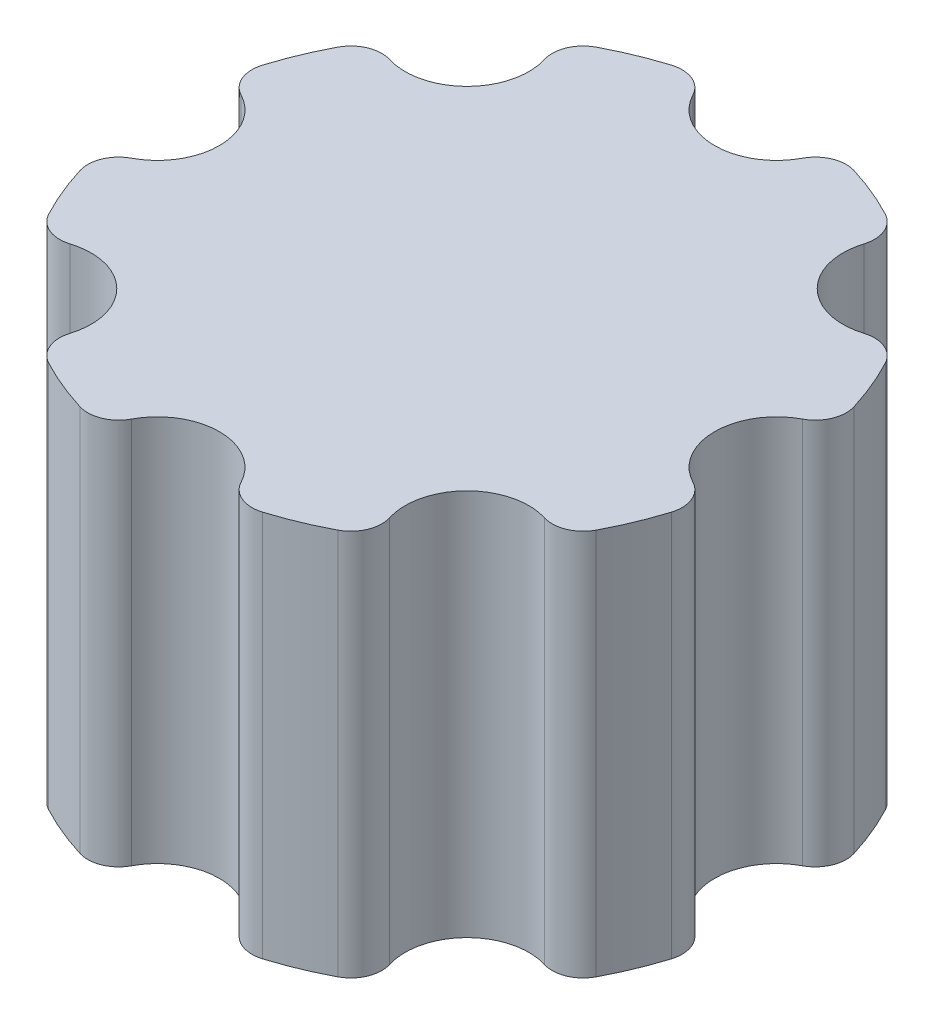
ISO-10303-21;
HEADER;
FILE_DESCRIPTION(('STEP AP214'),'2;1');
FILE_NAME('part.step','',(''),(''),'','','');
FILE_SCHEMA(('AUTOMOTIVE_DESIGN { 1 0 10303 214 1 1 1 1 }'));
ENDSEC;
DATA;
#1=APPLICATION_CONTEXT('core data for automotive mechanical design processes');
#2=APPLICATION_PROTOCOL_DEFINITION('international standard','automotive_design',2000,#1);
#3=PRODUCT_CONTEXT('',#1,'mechanical');
#4=PRODUCT('Part','Part','',(#3));
#5=PRODUCT_RELATED_PRODUCT_CATEGORY('part','',(#4));
#6=PRODUCT_DEFINITION_FORMATION('','',#4);
#7=PRODUCT_DEFINITION_CONTEXT('part definition',#1,'design');
#8=PRODUCT_DEFINITION('design','',#6,#7);
#9=PRODUCT_DEFINITION_SHAPE('','',#8);
#10=(LENGTH_UNIT() NAMED_UNIT(*) SI_UNIT(.MILLI.,.METRE.));
#11=(NAMED_UNIT(*) PLANE_ANGLE_UNIT() SI_UNIT($,.RADIAN.));
#12=(NAMED_UNIT(*) SI_UNIT($,.STERADIAN.) SOLID_ANGLE_UNIT());
#13=UNCERTAINTY_MEASURE_WITH_UNIT(LENGTH_MEASURE(1.E-05),#10,'distance_accuracy_value','');
#14=(GEOMETRIC_REPRESENTATION_CONTEXT(3) GLOBAL_UNCERTAINTY_ASSIGNED_CONTEXT((#13)) GLOBAL_UNIT_ASSIGNED_CONTEXT((#10,
#11,#12)) REPRESENTATION_CONTEXT('',''));
#15=CARTESIAN_POINT('',(0.,0.,0.));
#16=DIRECTION('',(0.,0.,1.));
#17=DIRECTION('',(1.,0.,0.));
#18=AXIS2_PLACEMENT_3D('',#15,#16,#17);
#19=CARTESIAN_POINT('',(0.,25.,0.));
#20=DIRECTION('',(0.,-1.,0.));
#21=DIRECTION('',(0.,0.,-1.));
#22=AXIS2_PLACEMENT_3D('',#19,#20,#21);
#23=CYLINDRICAL_SURFACE('',#22,20.);
#24=CARTESIAN_POINT('',(0.,0.,0.));
#25=DIRECTION('',(0.,1.,0.));
#26=DIRECTION('',(0.,0.,1.));
#27=AXIS2_PLACEMENT_3D('',#24,#25,#26);
#28=CIRCLE('',#27,20.);
#29=CARTESIAN_POINT('',(19.1111111111105,0.,-5.89622184952277));
#30=VERTEX_POINT('',#29);
#31=CARTESIAN_POINT('',(17.6828547158522,0.,-9.3443378095007));
#32=VERTEX_POINT('',#31);
#33=EDGE_CURVE('E288',#30,#32,#28,.T.);
#34=ORIENTED_EDGE('',*,*,#33,.T.);
#35=DIRECTION('',(0.,-1.,0.));
#36=VECTOR('',#35,1.);
#37=CARTESIAN_POINT('',(17.6828547158522,25.,-9.3443378095007));
#38=LINE('',#37,#36);
#39=CARTESIAN_POINT('',(17.6828547158522,25.,-9.3443378095007));
#40=VERTEX_POINT('',#39);
#41=EDGE_CURVE('E410',#32,#40,#38,.F.);
#42=ORIENTED_EDGE('',*,*,#41,.T.);
#43=CARTESIAN_POINT('',(0.,25.,0.));
#44=DIRECTION('',(0.,1.,0.));
#45=DIRECTION('',(0.,0.,1.));
#46=AXIS2_PLACEMENT_3D('',#43,#44,#45);
#47=CIRCLE('',#46,20.);
#48=CARTESIAN_POINT('',(19.1111111111105,25.,-5.89622184952277));
#49=VERTEX_POINT('',#48);
#50=EDGE_CURVE('E305',#49,#40,#47,.T.);
#51=ORIENTED_EDGE('',*,*,#50,.F.);
#52=DIRECTION('',(0.,-1.,0.));
#53=VECTOR('',#52,1.);
#54=CARTESIAN_POINT('',(19.1111111111105,25.,-5.89622184952277));
#55=LINE('',#54,#53);
#56=EDGE_CURVE('E407',#49,#30,#55,.T.);
#57=ORIENTED_EDGE('',*,*,#56,.T.);
#58=EDGE_LOOP('',(#34,#42,#51,#57));
#59=FACE_BOUND('',#58,.T.);
#60=ADVANCED_FACE('F37',(#59),#23,.T.);
#61=CARTESIAN_POINT('',(17.682854715855,0.,9.34433780949531));
#62=VERTEX_POINT('',#61);
#63=CARTESIAN_POINT('',(19.1111111111115,0.,5.89622184951951));
#64=VERTEX_POINT('',#63);
#65=EDGE_CURVE('E282',#62,#64,#28,.T.);
#66=ORIENTED_EDGE('',*,*,#65,.T.);
#67=DIRECTION('',(0.,-1.,0.));
#68=VECTOR('',#67,1.);
#69=CARTESIAN_POINT('',(19.1111111111115,25.,5.89622184951952));
#70=LINE('',#69,#68);
#71=CARTESIAN_POINT('',(19.1111111111115,25.,5.89622184951951));
#72=VERTEX_POINT('',#71);
#73=EDGE_CURVE('E420',#64,#72,#70,.F.);
#74=ORIENTED_EDGE('',*,*,#73,.T.);
#75=CARTESIAN_POINT('',(17.682854715855,25.,9.34433780949531));
#76=VERTEX_POINT('',#75);
#77=EDGE_CURVE('E307',#76,#72,#47,.T.);
#78=ORIENTED_EDGE('',*,*,#77,.F.);
#79=DIRECTION('',(0.,-1.,0.));
#80=VECTOR('',#79,1.);
#81=CARTESIAN_POINT('',(17.682854715855,25.,9.34433780949531));
#82=LINE('',#81,#80);
#83=EDGE_CURVE('E417',#76,#62,#82,.T.);
#84=ORIENTED_EDGE('',*,*,#83,.T.);
#85=EDGE_LOOP('',(#66,#74,#78,#84));
#86=FACE_BOUND('',#85,.T.);
#87=ADVANCED_FACE('F602',(#86),#23,.T.);
#88=CARTESIAN_POINT('',(5.89622184952762,25.,19.111111111109));
#89=VERTEX_POINT('',#88);
#90=CARTESIAN_POINT('',(9.34433780950046,25.,17.6828547158523));
#91=VERTEX_POINT('',#90);
#92=EDGE_CURVE('E311',#89,#91,#47,.T.);
#93=ORIENTED_EDGE('',*,*,#92,.F.);
#94=DIRECTION('',(0.,-1.,0.));
#95=VECTOR('',#94,1.);
#96=CARTESIAN_POINT('',(5.89622184952762,25.,19.111111111109));
#97=LINE('',#96,#95);
#98=CARTESIAN_POINT('',(5.89622184952762,0.,19.111111111109));
#99=VERTEX_POINT('',#98);
#100=EDGE_CURVE('E11',#89,#99,#97,.T.);
#101=ORIENTED_EDGE('',*,*,#100,.T.);
#102=CARTESIAN_POINT('',(9.34433780950046,0.,17.6828547158523));
#103=VERTEX_POINT('',#102);
#104=EDGE_CURVE('E275',#99,#103,#28,.T.);
#105=ORIENTED_EDGE('',*,*,#104,.T.);
#106=DIRECTION('',(0.,-1.,0.));
#107=VECTOR('',#106,1.);
#108=CARTESIAN_POINT('',(9.34433780950046,25.,17.6828547158523));
#109=LINE('',#108,#107);
#110=EDGE_CURVE('E45',#103,#91,#109,.F.);
#111=ORIENTED_EDGE('',*,*,#110,.T.);
#112=EDGE_LOOP('',(#93,#101,#105,#111));
#113=FACE_BOUND('',#112,.T.);
#114=ADVANCED_FACE('F329',(#113),#23,.T.);
#115=CARTESIAN_POINT('',(-9.34433780949342,0.,17.682854715856));
#116=VERTEX_POINT('',#115);
#117=CARTESIAN_POINT('',(-5.89622184952111,0.,19.111111111111));
#118=VERTEX_POINT('',#117);
#119=EDGE_CURVE('E264',#116,#118,#28,.T.);
#120=ORIENTED_EDGE('',*,*,#119,.T.);
#121=DIRECTION('',(0.,-1.,0.));
#122=VECTOR('',#121,1.);
#123=CARTESIAN_POINT('',(-5.89622184952111,25.,19.111111111111));
#124=LINE('',#123,#122);
#125=CARTESIAN_POINT('',(-5.89622184952111,25.,19.111111111111));
#126=VERTEX_POINT('',#125);
#127=EDGE_CURVE('E268',#118,#126,#124,.F.);
#128=ORIENTED_EDGE('',*,*,#127,.T.);
#129=CARTESIAN_POINT('',(-9.34433780949342,25.,17.682854715856));
#130=VERTEX_POINT('',#129);
#131=EDGE_CURVE('E267',#130,#126,#47,.T.);
#132=ORIENTED_EDGE('',*,*,#131,.F.);
#133=DIRECTION('',(0.,-1.,0.));
#134=VECTOR('',#133,1.);
#135=CARTESIAN_POINT('',(-9.34433780949342,25.,17.682854715856));
#136=LINE('',#135,#134);
#137=EDGE_CURVE('E251',#130,#116,#136,.T.);
#138=ORIENTED_EDGE('',*,*,#137,.T.);
#139=EDGE_LOOP('',(#120,#128,#132,#138));
#140=FACE_BOUND('',#139,.T.);
#141=ADVANCED_FACE('F262',(#140),#23,.T.);
#142=CARTESIAN_POINT('',(-19.1111111111096,0.,5.89622184952571));
#143=VERTEX_POINT('',#142);
#144=CARTESIAN_POINT('',(-17.6828547158533,0.,9.34433780949857));
#145=VERTEX_POINT('',#144);
#146=EDGE_CURVE('E274',#143,#145,#28,.T.);
#147=ORIENTED_EDGE('',*,*,#146,.T.);
#148=DIRECTION('',(0.,-1.,0.));
#149=VECTOR('',#148,1.);
#150=CARTESIAN_POINT('',(-17.6828547158533,25.,9.34433780949857));
#151=LINE('',#150,#149);
#152=CARTESIAN_POINT('',(-17.6828547158533,25.,9.34433780949857));
#153=VERTEX_POINT('',#152);
#154=EDGE_CURVE('E373',#145,#153,#151,.F.);
#155=ORIENTED_EDGE('',*,*,#154,.T.);
#156=CARTESIAN_POINT('',(-19.1111111111096,25.,5.89622184952571));
#157=VERTEX_POINT('',#156);
#158=EDGE_CURVE('E314',#157,#153,#47,.T.);
#159=ORIENTED_EDGE('',*,*,#158,.F.);
#160=DIRECTION('',(0.,-1.,0.));
#161=VECTOR('',#160,1.);
#162=CARTESIAN_POINT('',(-19.1111111111096,25.,5.89622184952571));
#163=LINE('',#162,#161);
#164=EDGE_CURVE('E370',#157,#143,#163,.T.);
#165=ORIENTED_EDGE('',*,*,#164,.T.);
#166=EDGE_LOOP('',(#147,#155,#159,#165));
#167=FACE_BOUND('',#166,.T.);
#168=ADVANCED_FACE('F584',(#167),#23,.T.);
#169=CARTESIAN_POINT('',(-17.6828547158537,0.,-9.34433780949779));
#170=VERTEX_POINT('',#169);
#171=CARTESIAN_POINT('',(-19.1111111111106,0.,-5.89622184952245));
#172=VERTEX_POINT('',#171);
#173=EDGE_CURVE('E280',#170,#172,#28,.T.);
#174=ORIENTED_EDGE('',*,*,#173,.T.);
#175=DIRECTION('',(0.,-1.,0.));
#176=VECTOR('',#175,1.);
#177=CARTESIAN_POINT('',(-19.1111111111106,25.,-5.89622184952245));
#178=LINE('',#177,#176);
#179=CARTESIAN_POINT('',(-19.1111111111106,25.,-5.89622184952245));
#180=VERTEX_POINT('',#179);
#181=EDGE_CURVE('E383',#172,#180,#178,.F.);
#182=ORIENTED_EDGE('',*,*,#181,.T.);
#183=CARTESIAN_POINT('',(-17.6828547158537,25.,-9.34433780949779));
#184=VERTEX_POINT('',#183);
#185=EDGE_CURVE('E316',#184,#180,#47,.T.);
#186=ORIENTED_EDGE('',*,*,#185,.F.);
#187=DIRECTION('',(0.,-1.,0.));
#188=VECTOR('',#187,1.);
#189=CARTESIAN_POINT('',(-17.6828547158537,25.,-9.34433780949779));
#190=LINE('',#189,#188);
#191=EDGE_CURVE('E380',#184,#170,#190,.T.);
#192=ORIENTED_EDGE('',*,*,#191,.T.);
#193=EDGE_LOOP('',(#174,#182,#186,#192));
#194=FACE_BOUND('',#193,.T.);
#195=ADVANCED_FACE('F499',(#194),#23,.T.);
#196=CARTESIAN_POINT('',(-5.89622184952072,0.,-19.1111111111111));
#197=VERTEX_POINT('',#196);
#198=CARTESIAN_POINT('',(-9.34433780949868,0.,-17.6828547158532));
#199=VERTEX_POINT('',#198);
#200=EDGE_CURVE('E277',#197,#199,#28,.T.);
#201=ORIENTED_EDGE('',*,*,#200,.T.);
#202=DIRECTION('',(0.,-1.,0.));
#203=VECTOR('',#202,1.);
#204=CARTESIAN_POINT('',(-9.34433780949868,25.,-17.6828547158532));
#205=LINE('',#204,#203);
#206=CARTESIAN_POINT('',(-9.34433780949868,25.,-17.6828547158532));
#207=VERTEX_POINT('',#206);
#208=EDGE_CURVE('E393',#199,#207,#205,.F.);
#209=ORIENTED_EDGE('',*,*,#208,.T.);
#210=CARTESIAN_POINT('',(-5.89622184952072,25.,-19.1111111111111));
#211=VERTEX_POINT('',#210);
#212=EDGE_CURVE('E313',#211,#207,#47,.T.);
#213=ORIENTED_EDGE('',*,*,#212,.F.);
#214=DIRECTION('',(0.,-1.,0.));
#215=VECTOR('',#214,1.);
#216=CARTESIAN_POINT('',(-5.89622184952072,25.,-19.1111111111111));
#217=LINE('',#216,#215);
#218=EDGE_CURVE('E390',#211,#197,#217,.T.);
#219=ORIENTED_EDGE('',*,*,#218,.T.);
#220=EDGE_LOOP('',(#201,#209,#213,#219));
#221=FACE_BOUND('',#220,.T.);
#222=ADVANCED_FACE('F515',(#221),#23,.T.);
#223=CARTESIAN_POINT('',(9.34433780949982,0.,-17.6828547158526));
#224=VERTEX_POINT('',#223);
#225=CARTESIAN_POINT('',(5.89622184952072,0.,-19.1111111111111));
#226=VERTEX_POINT('',#225);
#227=EDGE_CURVE('E278',#224,#226,#28,.T.);
#228=ORIENTED_EDGE('',*,*,#227,.T.);
#229=DIRECTION('',(0.,-1.,0.));
#230=VECTOR('',#229,1.);
#231=CARTESIAN_POINT('',(5.89622184952072,25.,-19.1111111111111));
#232=LINE('',#231,#230);
#233=CARTESIAN_POINT('',(5.89622184952072,25.,-19.1111111111111));
#234=VERTEX_POINT('',#233);
#235=EDGE_CURVE('E401',#226,#234,#232,.F.);
#236=ORIENTED_EDGE('',*,*,#235,.T.);
#237=CARTESIAN_POINT('',(9.34433780949982,25.,-17.6828547158526));
#238=VERTEX_POINT('',#237);
#239=EDGE_CURVE('E286',#238,#234,#47,.T.);
#240=ORIENTED_EDGE('',*,*,#239,.F.);
#241=DIRECTION('',(0.,-1.,0.));
#242=VECTOR('',#241,1.);
#243=CARTESIAN_POINT('',(9.34433780949982,25.,-17.6828547158526));
#244=LINE('',#243,#242);
#245=EDGE_CURVE('E399',#238,#224,#244,.T.);
#246=ORIENTED_EDGE('',*,*,#245,.T.);
#247=EDGE_LOOP('',(#228,#236,#240,#246));
#248=FACE_BOUND('',#247,.T.);
#249=ADVANCED_FACE('F525',(#248),#23,.T.);
#250=CARTESIAN_POINT('',(0.,25.,0.));
#251=DIRECTION('',(0.,1.,0.));
#252=DIRECTION('',(0.,0.,1.));
#253=AXIS2_PLACEMENT_3D('',#250,#251,#252);
#254=PLANE('',#253);
#255=ORIENTED_EDGE('',*,*,#131,.T.);
#256=CARTESIAN_POINT('',(-5.306599664569,25.,17.1999999999999));
#257=DIRECTION('',(0.,1.,0.));
#258=DIRECTION('',(0.,0.,1.));
#259=AXIS2_PLACEMENT_3D('',#256,#257,#258);
#260=CIRCLE('',#259,2.);
#261=CARTESIAN_POINT('',(-3.53773310971254,25.,18.1333333333327));
#262=VERTEX_POINT('',#261);
#263=EDGE_CURVE('E470',#126,#262,#260,.T.);
#264=ORIENTED_EDGE('',*,*,#263,.T.);
#265=CARTESIAN_POINT('',(3.40570654445189E-12,25.,20.));
#266=DIRECTION('',(0.,1.,0.));
#267=DIRECTION('',(0.,0.,1.));
#268=AXIS2_PLACEMENT_3D('',#265,#266,#267);
#269=CIRCLE('',#268,4.00000000000339);
#270=CARTESIAN_POINT('',(3.53773310971871,25.,18.1333333333315));
#271=VERTEX_POINT('',#270);
#272=EDGE_CURVE('E476',#271,#262,#269,.T.);
#273=ORIENTED_EDGE('',*,*,#272,.F.);
#274=CARTESIAN_POINT('',(5.30659966457486,25.,17.1999999999981));
#275=DIRECTION('',(0.,1.,0.));
#276=DIRECTION('',(0.,0.,1.));
#277=AXIS2_PLACEMENT_3D('',#274,#275,#276);
#278=CIRCLE('',#277,2.);
#279=EDGE_CURVE('E325',#271,#89,#278,.T.);
#280=ORIENTED_EDGE('',*,*,#279,.T.);
#281=ORIENTED_EDGE('',*,*,#92,.T.);
#282=CARTESIAN_POINT('',(8.40990402855041,25.,15.9145692442671));
#283=DIRECTION('',(0.,1.,0.));
#284=DIRECTION('',(0.,0.,1.));
#285=AXIS2_PLACEMENT_3D('',#282,#283,#284);
#286=CIRCLE('',#285,2.);
#287=CARTESIAN_POINT('',(10.3206478936108,25.,15.3237580374216));
#288=VERTEX_POINT('',#287);
#289=EDGE_CURVE('E321',#91,#288,#286,.T.);
#290=ORIENTED_EDGE('',*,*,#289,.T.);
#291=CARTESIAN_POINT('',(14.1421356237339,25.,14.1421356237297));
#292=DIRECTION('',(0.,1.,0.));
#293=DIRECTION('',(0.,0.,1.));
#294=AXIS2_PLACEMENT_3D('',#291,#292,#293);
#295=CIRCLE('',#294,4.00000000000253);
#296=CARTESIAN_POINT('',(15.3237580374245,25.,10.3206478936063));
#297=VERTEX_POINT('',#296);
#298=EDGE_CURVE('E430',#297,#288,#295,.T.);
#299=ORIENTED_EDGE('',*,*,#298,.F.);
#300=CARTESIAN_POINT('',(15.9145692442695,25.,8.40990402854578));
#301=DIRECTION('',(0.,1.,0.));
#302=DIRECTION('',(0.,0.,1.));
#303=AXIS2_PLACEMENT_3D('',#300,#301,#302);
#304=CIRCLE('',#303,2.);
#305=EDGE_CURVE('E436',#297,#76,#304,.T.);
#306=ORIENTED_EDGE('',*,*,#305,.T.);
#307=ORIENTED_EDGE('',*,*,#77,.T.);
#308=CARTESIAN_POINT('',(17.2000000000003,25.,5.30659966456756));
#309=DIRECTION('',(0.,1.,0.));
#310=DIRECTION('',(0.,0.,1.));
#311=AXIS2_PLACEMENT_3D('',#308,#309,#310);
#312=CIRCLE('',#311,2.);
#313=CARTESIAN_POINT('',(18.1333333333339,25.,3.5377331097115));
#314=VERTEX_POINT('',#313);
#315=EDGE_CURVE('E442',#72,#314,#312,.T.);
#316=ORIENTED_EDGE('',*,*,#315,.T.);
#317=CARTESIAN_POINT('',(20.0000000000017,25.,-1.70285327222595E-12));
#318=DIRECTION('',(0.,1.,0.));
#319=DIRECTION('',(0.,0.,1.));
#320=AXIS2_PLACEMENT_3D('',#317,#318,#319);
#321=CIRCLE('',#320,4.0000000000012);
#322=CARTESIAN_POINT('',(18.1333333333333,25.,-3.53773310971459));
#323=VERTEX_POINT('',#322);
#324=EDGE_CURVE('E555',#323,#314,#321,.T.);
#325=ORIENTED_EDGE('',*,*,#324,.F.);
#326=CARTESIAN_POINT('',(17.1999999999994,25.,-5.30659966457049));
#327=DIRECTION('',(0.,1.,0.));
#328=DIRECTION('',(0.,0.,1.));
#329=AXIS2_PLACEMENT_3D('',#326,#327,#328);
#330=CIRCLE('',#329,2.);
#331=EDGE_CURVE('E444',#323,#49,#330,.T.);
#332=ORIENTED_EDGE('',*,*,#331,.T.);
#333=ORIENTED_EDGE('',*,*,#50,.T.);
#334=CARTESIAN_POINT('',(15.914569244267,25.,-8.40990402855063));
#335=DIRECTION('',(0.,1.,0.));
#336=DIRECTION('',(0.,0.,1.));
#337=AXIS2_PLACEMENT_3D('',#334,#335,#336);
#338=CIRCLE('',#337,2.);
#339=CARTESIAN_POINT('',(15.3237580374218,25.,-10.3206478936111));
#340=VERTEX_POINT('',#339);
#341=EDGE_CURVE('E450',#40,#340,#338,.T.);
#342=ORIENTED_EDGE('',*,*,#341,.T.);
#343=CARTESIAN_POINT('',(14.1421356237314,25.,-14.1421356237322));
#344=DIRECTION('',(0.,1.,0.));
#345=DIRECTION('',(0.,0.,1.));
#346=AXIS2_PLACEMENT_3D('',#343,#344,#345);
#347=CIRCLE('',#346,4.00000000000016);
#348=CARTESIAN_POINT('',(10.3206478936103,25.,-15.3237580374223));
#349=VERTEX_POINT('',#348);
#350=EDGE_CURVE('E296',#349,#340,#347,.T.);
#351=ORIENTED_EDGE('',*,*,#350,.F.);
#352=CARTESIAN_POINT('',(8.40990402854984,25.,-15.9145692442674));
#353=DIRECTION('',(0.,1.,0.));
#354=DIRECTION('',(0.,0.,1.));
#355=AXIS2_PLACEMENT_3D('',#352,#353,#354);
#356=CIRCLE('',#355,2.);
#357=EDGE_CURVE('E452',#349,#238,#356,.T.);
#358=ORIENTED_EDGE('',*,*,#357,.T.);
#359=ORIENTED_EDGE('',*,*,#239,.T.);
#360=CARTESIAN_POINT('',(5.30659966456865,25.,-17.2));
#361=DIRECTION('',(0.,1.,0.));
#362=DIRECTION('',(0.,0.,1.));
#363=AXIS2_PLACEMENT_3D('',#360,#361,#362);
#364=CIRCLE('',#363,2.);
#365=CARTESIAN_POINT('',(3.53773310971243,25.,-18.1333333333333));
#366=VERTEX_POINT('',#365);
#367=EDGE_CURVE('E454',#234,#366,#364,.T.);
#368=ORIENTED_EDGE('',*,*,#367,.T.);
#369=CARTESIAN_POINT('',(0.,25.,-20.));
#370=DIRECTION('',(0.,1.,0.));
#371=DIRECTION('',(0.,0.,1.));
#372=AXIS2_PLACEMENT_3D('',#369,#370,#371);
#373=CIRCLE('',#372,4.);
#374=CARTESIAN_POINT('',(-3.53773310971243,25.,-18.1333333333333));
#375=VERTEX_POINT('',#374);
#376=EDGE_CURVE('E289',#375,#366,#373,.T.);
#377=ORIENTED_EDGE('',*,*,#376,.F.);
#378=CARTESIAN_POINT('',(-5.30659966456865,25.,-17.2));
#379=DIRECTION('',(0.,1.,0.));
#380=DIRECTION('',(0.,0.,1.));
#381=AXIS2_PLACEMENT_3D('',#378,#379,#380);
#382=CIRCLE('',#381,2.);
#383=EDGE_CURVE('E456',#375,#211,#382,.T.);
#384=ORIENTED_EDGE('',*,*,#383,.T.);
#385=ORIENTED_EDGE('',*,*,#212,.T.);
#386=CARTESIAN_POINT('',(-8.40990402854882,25.,-15.9145692442679));
#387=DIRECTION('',(0.,1.,0.));
#388=DIRECTION('',(0.,0.,1.));
#389=AXIS2_PLACEMENT_3D('',#386,#387,#388);
#390=CIRCLE('',#389,2.);
#391=CARTESIAN_POINT('',(-10.320647893609,25.,-15.323758037422));
#392=VERTEX_POINT('',#391);
#393=EDGE_CURVE('E458',#207,#392,#390,.T.);
#394=ORIENTED_EDGE('',*,*,#393,.T.);
#395=CARTESIAN_POINT('',(-14.1421356237305,25.,-14.1421356237297));
#396=DIRECTION('',(0.,1.,0.));
#397=DIRECTION('',(0.,0.,1.));
#398=AXIS2_PLACEMENT_3D('',#395,#396,#397);
#399=CIRCLE('',#398,4.00000000000107);
#400=CARTESIAN_POINT('',(-15.3237580374225,25.,-10.3206478936082));
#401=VERTEX_POINT('',#400);
#402=EDGE_CURVE('E303',#401,#392,#399,.T.);
#403=ORIENTED_EDGE('',*,*,#402,.F.);
#404=CARTESIAN_POINT('',(-15.9145692442683,25.,-8.40990402854801));
#405=DIRECTION('',(0.,1.,0.));
#406=DIRECTION('',(0.,0.,1.));
#407=AXIS2_PLACEMENT_3D('',#404,#405,#406);
#408=CIRCLE('',#407,2.);
#409=EDGE_CURVE('E460',#401,#184,#408,.T.);
#410=ORIENTED_EDGE('',*,*,#409,.T.);
#411=ORIENTED_EDGE('',*,*,#185,.T.);
#412=CARTESIAN_POINT('',(-17.1999999999995,25.,-5.3065996645702));
#413=DIRECTION('',(0.,1.,0.));
#414=DIRECTION('',(0.,0.,1.));
#415=AXIS2_PLACEMENT_3D('',#412,#413,#414);
#416=CIRCLE('',#415,2.);
#417=CARTESIAN_POINT('',(-18.1333333333321,25.,-3.53773310971359));
#418=VERTEX_POINT('',#417);
#419=EDGE_CURVE('E462',#180,#418,#416,.T.);
#420=ORIENTED_EDGE('',*,*,#419,.T.);
#421=CARTESIAN_POINT('',(-19.9999999999983,25.,1.70530256582424E-12));
#422=DIRECTION('',(0.,1.,0.));
#423=DIRECTION('',(0.,0.,1.));
#424=AXIS2_PLACEMENT_3D('',#421,#422,#423);
#425=CIRCLE('',#424,4.00000000000233);
#426=CARTESIAN_POINT('',(-18.1333333333315,25.,3.53773310971668));
#427=VERTEX_POINT('',#426);
#428=EDGE_CURVE('E568',#427,#418,#425,.T.);
#429=ORIENTED_EDGE('',*,*,#428,.F.);
#430=CARTESIAN_POINT('',(-17.1999999999986,25.,5.30659966457314));
#431=DIRECTION('',(0.,1.,0.));
#432=DIRECTION('',(0.,0.,1.));
#433=AXIS2_PLACEMENT_3D('',#430,#431,#432);
#434=CIRCLE('',#433,2.);
#435=EDGE_CURVE('E464',#427,#157,#434,.T.);
#436=ORIENTED_EDGE('',*,*,#435,.T.);
#437=ORIENTED_EDGE('',*,*,#158,.T.);
#438=CARTESIAN_POINT('',(-15.914569244268,25.,8.40990402854871));
#439=DIRECTION('',(0.,1.,0.));
#440=DIRECTION('',(0.,0.,1.));
#441=AXIS2_PLACEMENT_3D('',#438,#439,#440);
#442=CIRCLE('',#441,2.);
#443=CARTESIAN_POINT('',(-15.3237580374217,25.,10.3206478936088));
#444=VERTEX_POINT('',#443);
#445=EDGE_CURVE('E466',#153,#444,#442,.T.);
#446=ORIENTED_EDGE('',*,*,#445,.T.);
#447=CARTESIAN_POINT('',(-14.142135623728,25.,14.1421356237322));
#448=DIRECTION('',(0.,1.,0.));
#449=DIRECTION('',(0.,0.,1.));
#450=AXIS2_PLACEMENT_3D('',#447,#448,#449);
#451=CIRCLE('',#450,4.0000000000033);
#452=CARTESIAN_POINT('',(-10.3206478936044,25.,15.3237580374247));
#453=VERTEX_POINT('',#452);
#454=EDGE_CURVE('E563',#453,#444,#451,.T.);
#455=ORIENTED_EDGE('',*,*,#454,.F.);
#456=CARTESIAN_POINT('',(-8.40990402854408,25.,15.9145692442704));
#457=DIRECTION('',(0.,1.,0.));
#458=DIRECTION('',(0.,0.,1.));
#459=AXIS2_PLACEMENT_3D('',#456,#457,#458);
#460=CIRCLE('',#459,2.);
#461=EDGE_CURVE('E468',#453,#130,#460,.T.);
#462=ORIENTED_EDGE('',*,*,#461,.T.);
#463=EDGE_LOOP('',(#255,#264,#273,#280,#281,#290,#299,#306,#307,#316,#325,#332,#333,#342,#351,
#358,#359,#368,#377,#384,#385,#394,#403,#410,#411,#420,#429,#436,#437,#446,#455,#462));
#464=FACE_BOUND('',#463,.T.);
#465=ADVANCED_FACE('F319',(#464),#254,.T.);
#466=CARTESIAN_POINT('',(0.,0.,0.));
#467=DIRECTION('',(0.,1.,0.));
#468=DIRECTION('',(0.,0.,1.));
#469=AXIS2_PLACEMENT_3D('',#466,#467,#468);
#470=PLANE('',#469);
#471=CARTESIAN_POINT('',(3.40570654445189E-12,0.,20.));
#472=DIRECTION('',(0.,1.,0.));
#473=DIRECTION('',(0.,0.,1.));
#474=AXIS2_PLACEMENT_3D('',#471,#472,#473);
#475=CIRCLE('',#474,4.00000000000339);
#476=CARTESIAN_POINT('',(3.53773310971871,0.,18.1333333333315));
#477=VERTEX_POINT('',#476);
#478=CARTESIAN_POINT('',(-3.53773310971254,0.,18.1333333333327));
#479=VERTEX_POINT('',#478);
#480=EDGE_CURVE('E438',#477,#479,#475,.T.);
#481=ORIENTED_EDGE('',*,*,#480,.T.);
#482=CARTESIAN_POINT('',(-5.306599664569,0.,17.1999999999999));
#483=DIRECTION('',(0.,1.,0.));
#484=DIRECTION('',(0.,0.,1.));
#485=AXIS2_PLACEMENT_3D('',#482,#483,#484);
#486=CIRCLE('',#485,2.);
#487=EDGE_CURVE('E256',#479,#118,#486,.F.);
#488=ORIENTED_EDGE('',*,*,#487,.T.);
#489=ORIENTED_EDGE('',*,*,#119,.F.);
#490=CARTESIAN_POINT('',(-8.40990402854408,0.,15.9145692442704));
#491=DIRECTION('',(0.,1.,0.));
#492=DIRECTION('',(0.,0.,1.));
#493=AXIS2_PLACEMENT_3D('',#490,#491,#492);
#494=CIRCLE('',#493,2.);
#495=CARTESIAN_POINT('',(-10.3206478936044,0.,15.3237580374247));
#496=VERTEX_POINT('',#495);
#497=EDGE_CURVE('E247',#116,#496,#494,.F.);
#498=ORIENTED_EDGE('',*,*,#497,.T.);
#499=CARTESIAN_POINT('',(-14.142135623728,0.,14.1421356237322));
#500=DIRECTION('',(0.,1.,0.));
#501=DIRECTION('',(0.,0.,1.));
#502=AXIS2_PLACEMENT_3D('',#499,#500,#501);
#503=CIRCLE('',#502,4.0000000000033);
#504=CARTESIAN_POINT('',(-15.3237580374217,0.,10.3206478936088));
#505=VERTEX_POINT('',#504);
#506=EDGE_CURVE('E561',#496,#505,#503,.T.);
#507=ORIENTED_EDGE('',*,*,#506,.T.);
#508=CARTESIAN_POINT('',(-15.914569244268,0.,8.40990402854871));
#509=DIRECTION('',(0.,1.,0.));
#510=DIRECTION('',(0.,0.,1.));
#511=AXIS2_PLACEMENT_3D('',#508,#509,#510);
#512=CIRCLE('',#511,2.);
#513=EDGE_CURVE('E257',#505,#145,#512,.F.);
#514=ORIENTED_EDGE('',*,*,#513,.T.);
#515=ORIENTED_EDGE('',*,*,#146,.F.);
#516=CARTESIAN_POINT('',(-17.1999999999986,0.,5.30659966457314));
#517=DIRECTION('',(0.,1.,0.));
#518=DIRECTION('',(0.,0.,1.));
#519=AXIS2_PLACEMENT_3D('',#516,#517,#518);
#520=CIRCLE('',#519,2.);
#521=CARTESIAN_POINT('',(-18.1333333333315,0.,3.53773310971668));
#522=VERTEX_POINT('',#521);
#523=EDGE_CURVE('E363',#143,#522,#520,.F.);
#524=ORIENTED_EDGE('',*,*,#523,.T.);
#525=CARTESIAN_POINT('',(-19.9999999999983,0.,1.70530256582424E-12));
#526=DIRECTION('',(0.,1.,0.));
#527=DIRECTION('',(0.,0.,1.));
#528=AXIS2_PLACEMENT_3D('',#525,#526,#527);
#529=CIRCLE('',#528,4.00000000000233);
#530=CARTESIAN_POINT('',(-18.1333333333321,0.,-3.53773310971359));
#531=VERTEX_POINT('',#530);
#532=EDGE_CURVE('E566',#522,#531,#529,.T.);
#533=ORIENTED_EDGE('',*,*,#532,.T.);
#534=CARTESIAN_POINT('',(-17.1999999999995,0.,-5.3065996645702));
#535=DIRECTION('',(0.,1.,0.));
#536=DIRECTION('',(0.,0.,1.));
#537=AXIS2_PLACEMENT_3D('',#534,#535,#536);
#538=CIRCLE('',#537,2.);
#539=EDGE_CURVE('E361',#531,#172,#538,.F.);
#540=ORIENTED_EDGE('',*,*,#539,.T.);
#541=ORIENTED_EDGE('',*,*,#173,.F.);
#542=CARTESIAN_POINT('',(-15.9145692442683,0.,-8.40990402854801));
#543=DIRECTION('',(0.,1.,0.));
#544=DIRECTION('',(0.,0.,1.));
#545=AXIS2_PLACEMENT_3D('',#542,#543,#544);
#546=CIRCLE('',#545,2.);
#547=CARTESIAN_POINT('',(-15.3237580374225,0.,-10.3206478936082));
#548=VERTEX_POINT('',#547);
#549=EDGE_CURVE('E359',#170,#548,#546,.F.);
#550=ORIENTED_EDGE('',*,*,#549,.T.);
#551=CARTESIAN_POINT('',(-14.1421356237305,0.,-14.1421356237297));
#552=DIRECTION('',(0.,1.,0.));
#553=DIRECTION('',(0.,0.,1.));
#554=AXIS2_PLACEMENT_3D('',#551,#552,#553);
#555=CIRCLE('',#554,4.00000000000107);
#556=CARTESIAN_POINT('',(-10.320647893609,0.,-15.323758037422));
#557=VERTEX_POINT('',#556);
#558=EDGE_CURVE('E484',#548,#557,#555,.T.);
#559=ORIENTED_EDGE('',*,*,#558,.T.);
#560=CARTESIAN_POINT('',(-8.40990402854882,0.,-15.9145692442679));
#561=DIRECTION('',(0.,1.,0.));
#562=DIRECTION('',(0.,0.,1.));
#563=AXIS2_PLACEMENT_3D('',#560,#561,#562);
#564=CIRCLE('',#563,2.);
#565=EDGE_CURVE('E357',#557,#199,#564,.F.);
#566=ORIENTED_EDGE('',*,*,#565,.T.);
#567=ORIENTED_EDGE('',*,*,#200,.F.);
#568=CARTESIAN_POINT('',(-5.30659966456865,0.,-17.2));
#569=DIRECTION('',(0.,1.,0.));
#570=DIRECTION('',(0.,0.,1.));
#571=AXIS2_PLACEMENT_3D('',#568,#569,#570);
#572=CIRCLE('',#571,2.);
#573=CARTESIAN_POINT('',(-3.53773310971243,0.,-18.1333333333333));
#574=VERTEX_POINT('',#573);
#575=EDGE_CURVE('E59',#197,#574,#572,.F.);
#576=ORIENTED_EDGE('',*,*,#575,.T.);
#577=CARTESIAN_POINT('',(0.,0.,-20.));
#578=DIRECTION('',(0.,1.,0.));
#579=DIRECTION('',(0.,0.,1.));
#580=AXIS2_PLACEMENT_3D('',#577,#578,#579);
#581=CIRCLE('',#580,4.);
#582=CARTESIAN_POINT('',(3.53773310971243,0.,-18.1333333333333));
#583=VERTEX_POINT('',#582);
#584=EDGE_CURVE('E486',#574,#583,#581,.T.);
#585=ORIENTED_EDGE('',*,*,#584,.T.);
#586=CARTESIAN_POINT('',(5.30659966456865,0.,-17.2));
#587=DIRECTION('',(0.,1.,0.));
#588=DIRECTION('',(0.,0.,1.));
#589=AXIS2_PLACEMENT_3D('',#586,#587,#588);
#590=CIRCLE('',#589,2.);
#591=EDGE_CURVE('E354',#583,#226,#590,.F.);
#592=ORIENTED_EDGE('',*,*,#591,.T.);
#593=ORIENTED_EDGE('',*,*,#227,.F.);
#594=CARTESIAN_POINT('',(8.40990402854984,0.,-15.9145692442674));
#595=DIRECTION('',(0.,1.,0.));
#596=DIRECTION('',(0.,0.,1.));
#597=AXIS2_PLACEMENT_3D('',#594,#595,#596);
#598=CIRCLE('',#597,2.);
#599=CARTESIAN_POINT('',(10.3206478936103,0.,-15.3237580374223));
#600=VERTEX_POINT('',#599);
#601=EDGE_CURVE('E352',#224,#600,#598,.F.);
#602=ORIENTED_EDGE('',*,*,#601,.T.);
#603=CARTESIAN_POINT('',(14.1421356237314,0.,-14.1421356237322));
#604=DIRECTION('',(0.,1.,0.));
#605=DIRECTION('',(0.,0.,1.));
#606=AXIS2_PLACEMENT_3D('',#603,#604,#605);
#607=CIRCLE('',#606,4.00000000000016);
#608=CARTESIAN_POINT('',(15.3237580374218,0.,-10.3206478936111));
#609=VERTEX_POINT('',#608);
#610=EDGE_CURVE('E269',#600,#609,#607,.T.);
#611=ORIENTED_EDGE('',*,*,#610,.T.);
#612=CARTESIAN_POINT('',(15.914569244267,0.,-8.40990402855063));
#613=DIRECTION('',(0.,1.,0.));
#614=DIRECTION('',(0.,0.,1.));
#615=AXIS2_PLACEMENT_3D('',#612,#613,#614);
#616=CIRCLE('',#615,2.);
#617=EDGE_CURVE('E350',#609,#32,#616,.F.);
#618=ORIENTED_EDGE('',*,*,#617,.T.);
#619=ORIENTED_EDGE('',*,*,#33,.F.);
#620=CARTESIAN_POINT('',(17.1999999999994,0.,-5.30659966457049));
#621=DIRECTION('',(0.,1.,0.));
#622=DIRECTION('',(0.,0.,1.));
#623=AXIS2_PLACEMENT_3D('',#620,#621,#622);
#624=CIRCLE('',#623,2.);
#625=CARTESIAN_POINT('',(18.1333333333333,0.,-3.53773310971459));
#626=VERTEX_POINT('',#625);
#627=EDGE_CURVE('E348',#30,#626,#624,.F.);
#628=ORIENTED_EDGE('',*,*,#627,.T.);
#629=CARTESIAN_POINT('',(20.0000000000017,0.,-1.70285327222595E-12));
#630=DIRECTION('',(0.,1.,0.));
#631=DIRECTION('',(0.,0.,1.));
#632=AXIS2_PLACEMENT_3D('',#629,#630,#631);
#633=CIRCLE('',#632,4.0000000000012);
#634=CARTESIAN_POINT('',(18.1333333333339,0.,3.5377331097115));
#635=VERTEX_POINT('',#634);
#636=EDGE_CURVE('E300',#626,#635,#633,.T.);
#637=ORIENTED_EDGE('',*,*,#636,.T.);
#638=CARTESIAN_POINT('',(17.2000000000003,0.,5.30659966456756));
#639=DIRECTION('',(0.,1.,0.));
#640=DIRECTION('',(0.,0.,1.));
#641=AXIS2_PLACEMENT_3D('',#638,#639,#640);
#642=CIRCLE('',#641,2.);
#643=EDGE_CURVE('E341',#635,#64,#642,.F.);
#644=ORIENTED_EDGE('',*,*,#643,.T.);
#645=ORIENTED_EDGE('',*,*,#65,.F.);
#646=CARTESIAN_POINT('',(15.9145692442695,0.,8.40990402854578));
#647=DIRECTION('',(0.,1.,0.));
#648=DIRECTION('',(0.,0.,1.));
#649=AXIS2_PLACEMENT_3D('',#646,#647,#648);
#650=CIRCLE('',#649,2.);
#651=CARTESIAN_POINT('',(15.3237580374245,0.,10.3206478936063));
#652=VERTEX_POINT('',#651);
#653=EDGE_CURVE('E338',#62,#652,#650,.F.);
#654=ORIENTED_EDGE('',*,*,#653,.T.);
#655=CARTESIAN_POINT('',(14.1421356237339,0.,14.1421356237297));
#656=DIRECTION('',(0.,1.,0.));
#657=DIRECTION('',(0.,0.,1.));
#658=AXIS2_PLACEMENT_3D('',#655,#656,#657);
#659=CIRCLE('',#658,4.00000000000253);
#660=CARTESIAN_POINT('',(10.3206478936108,0.,15.3237580374216));
#661=VERTEX_POINT('',#660);
#662=EDGE_CURVE('E433',#652,#661,#659,.T.);
#663=ORIENTED_EDGE('',*,*,#662,.T.);
#664=CARTESIAN_POINT('',(8.40990402855041,0.,15.9145692442671));
#665=DIRECTION('',(0.,1.,0.));
#666=DIRECTION('',(0.,0.,1.));
#667=AXIS2_PLACEMENT_3D('',#664,#665,#666);
#668=CIRCLE('',#667,2.);
#669=EDGE_CURVE('E339',#661,#103,#668,.F.);
#670=ORIENTED_EDGE('',*,*,#669,.T.);
#671=ORIENTED_EDGE('',*,*,#104,.F.);
#672=CARTESIAN_POINT('',(5.30659966457486,0.,17.1999999999981));
#673=DIRECTION('',(0.,1.,0.));
#674=DIRECTION('',(0.,0.,1.));
#675=AXIS2_PLACEMENT_3D('',#672,#673,#674);
#676=CIRCLE('',#675,2.);
#677=EDGE_CURVE('E335',#99,#477,#676,.F.);
#678=ORIENTED_EDGE('',*,*,#677,.T.);
#679=EDGE_LOOP('',(#481,#488,#489,#498,#507,#514,#515,#524,#533,#540,#541,#550,#559,#566,#567,
#576,#585,#592,#593,#602,#611,#618,#619,#628,#637,#644,#645,#654,#663,#670,#671,#678));
#680=FACE_BOUND('',#679,.T.);
#681=ADVANCED_FACE('F272',(#680),#470,.F.);
#682=CARTESIAN_POINT('',(0.,0.,-20.));
#683=DIRECTION('',(0.,1.,0.));
#684=DIRECTION('',(0.,0.,1.));
#685=AXIS2_PLACEMENT_3D('',#682,#683,#684);
#686=CYLINDRICAL_SURFACE('',#685,4.);
#687=ORIENTED_EDGE('',*,*,#584,.F.);
#688=DIRECTION('',(0.,1.,0.));
#689=VECTOR('',#688,1.);
#690=CARTESIAN_POINT('',(-3.53773310971243,0.,-18.1333333333333));
#691=LINE('',#690,#689);
#692=EDGE_CURVE('E397',#574,#375,#691,.T.);
#693=ORIENTED_EDGE('',*,*,#692,.T.);
#694=ORIENTED_EDGE('',*,*,#376,.T.);
#695=DIRECTION('',(0.,1.,0.));
#696=VECTOR('',#695,1.);
#697=CARTESIAN_POINT('',(3.53773310971243,0.,-18.1333333333333));
#698=LINE('',#697,#696);
#699=EDGE_CURVE('E52',#366,#583,#698,.F.);
#700=ORIENTED_EDGE('',*,*,#699,.T.);
#701=EDGE_LOOP('',(#687,#693,#694,#700));
#702=FACE_BOUND('',#701,.T.);
#703=ADVANCED_FACE('F521',(#702),#686,.F.);
#704=CARTESIAN_POINT('',(-14.1421356237305,0.,-14.1421356237297));
#705=DIRECTION('',(0.,1.,0.));
#706=DIRECTION('',(0.,0.,1.));
#707=AXIS2_PLACEMENT_3D('',#704,#705,#706);
#708=CYLINDRICAL_SURFACE('',#707,4.00000000000107);
#709=ORIENTED_EDGE('',*,*,#558,.F.);
#710=DIRECTION('',(0.,1.,0.));
#711=VECTOR('',#710,1.);
#712=CARTESIAN_POINT('',(-15.3237580374225,0.,-10.3206478936082));
#713=LINE('',#712,#711);
#714=EDGE_CURVE('E388',#548,#401,#713,.T.);
#715=ORIENTED_EDGE('',*,*,#714,.T.);
#716=ORIENTED_EDGE('',*,*,#402,.T.);
#717=DIRECTION('',(0.,1.,0.));
#718=VECTOR('',#717,1.);
#719=CARTESIAN_POINT('',(-10.320647893609,0.,-15.323758037422));
#720=LINE('',#719,#718);
#721=EDGE_CURVE('E386',#392,#557,#720,.F.);
#722=ORIENTED_EDGE('',*,*,#721,.T.);
#723=EDGE_LOOP('',(#709,#715,#716,#722));
#724=FACE_BOUND('',#723,.T.);
#725=ADVANCED_FACE('F508',(#724),#708,.F.);
#726=CARTESIAN_POINT('',(-19.9999999999983,0.,1.70530256582424E-12));
#727=DIRECTION('',(0.,1.,0.));
#728=DIRECTION('',(0.,0.,1.));
#729=AXIS2_PLACEMENT_3D('',#726,#727,#728);
#730=CYLINDRICAL_SURFACE('',#729,4.00000000000233);
#731=ORIENTED_EDGE('',*,*,#532,.F.);
#732=DIRECTION('',(0.,1.,0.));
#733=VECTOR('',#732,1.);
#734=CARTESIAN_POINT('',(-18.1333333333315,0.,3.53773310971668));
#735=LINE('',#734,#733);
#736=EDGE_CURVE('E378',#522,#427,#735,.T.);
#737=ORIENTED_EDGE('',*,*,#736,.T.);
#738=ORIENTED_EDGE('',*,*,#428,.T.);
#739=DIRECTION('',(0.,1.,0.));
#740=VECTOR('',#739,1.);
#741=CARTESIAN_POINT('',(-18.1333333333321,0.,-3.53773310971359));
#742=LINE('',#741,#740);
#743=EDGE_CURVE('E376',#418,#531,#742,.F.);
#744=ORIENTED_EDGE('',*,*,#743,.T.);
#745=EDGE_LOOP('',(#731,#737,#738,#744));
#746=FACE_BOUND('',#745,.T.);
#747=ADVANCED_FACE('F572',(#746),#730,.F.);
#748=CARTESIAN_POINT('',(-14.142135623728,0.,14.1421356237322));
#749=DIRECTION('',(0.,1.,0.));
#750=DIRECTION('',(0.,0.,1.));
#751=AXIS2_PLACEMENT_3D('',#748,#749,#750);
#752=CYLINDRICAL_SURFACE('',#751,4.0000000000033);
#753=ORIENTED_EDGE('',*,*,#506,.F.);
#754=DIRECTION('',(0.,1.,0.));
#755=VECTOR('',#754,1.);
#756=CARTESIAN_POINT('',(-10.3206478936044,0.,15.3237580374247));
#757=LINE('',#756,#755);
#758=EDGE_CURVE('E252',#496,#453,#757,.T.);
#759=ORIENTED_EDGE('',*,*,#758,.T.);
#760=ORIENTED_EDGE('',*,*,#454,.T.);
#761=DIRECTION('',(0.,1.,0.));
#762=VECTOR('',#761,1.);
#763=CARTESIAN_POINT('',(-15.3237580374217,0.,10.3206478936088));
#764=LINE('',#763,#762);
#765=EDGE_CURVE('E367',#444,#505,#764,.F.);
#766=ORIENTED_EDGE('',*,*,#765,.T.);
#767=EDGE_LOOP('',(#753,#759,#760,#766));
#768=FACE_BOUND('',#767,.T.);
#769=ADVANCED_FACE('F592',(#768),#752,.F.);
#770=CARTESIAN_POINT('',(3.40570654445189E-12,0.,20.));
#771=DIRECTION('',(0.,1.,0.));
#772=DIRECTION('',(0.,0.,1.));
#773=AXIS2_PLACEMENT_3D('',#770,#771,#772);
#774=CYLINDRICAL_SURFACE('',#773,4.00000000000339);
#775=ORIENTED_EDGE('',*,*,#272,.T.);
#776=DIRECTION('',(0.,1.,0.));
#777=VECTOR('',#776,1.);
#778=CARTESIAN_POINT('',(-3.53773310971254,0.,18.1333333333327));
#779=LINE('',#778,#777);
#780=EDGE_CURVE('E343',#262,#479,#779,.F.);
#781=ORIENTED_EDGE('',*,*,#780,.T.);
#782=ORIENTED_EDGE('',*,*,#480,.F.);
#783=DIRECTION('',(0.,1.,0.));
#784=VECTOR('',#783,1.);
#785=CARTESIAN_POINT('',(3.53773310971871,0.,18.1333333333315));
#786=LINE('',#785,#784);
#787=EDGE_CURVE('E336',#477,#271,#786,.T.);
#788=ORIENTED_EDGE('',*,*,#787,.T.);
#789=EDGE_LOOP('',(#775,#781,#782,#788));
#790=FACE_BOUND('',#789,.T.);
#791=ADVANCED_FACE('F475',(#790),#774,.F.);
#792=CARTESIAN_POINT('',(14.1421356237339,0.,14.1421356237297));
#793=DIRECTION('',(0.,1.,0.));
#794=DIRECTION('',(0.,0.,1.));
#795=AXIS2_PLACEMENT_3D('',#792,#793,#794);
#796=CYLINDRICAL_SURFACE('',#795,4.00000000000253);
#797=ORIENTED_EDGE('',*,*,#662,.F.);
#798=DIRECTION('',(0.,1.,0.));
#799=VECTOR('',#798,1.);
#800=CARTESIAN_POINT('',(15.3237580374245,0.,10.3206478936063));
#801=LINE('',#800,#799);
#802=EDGE_CURVE('E425',#652,#297,#801,.T.);
#803=ORIENTED_EDGE('',*,*,#802,.T.);
#804=ORIENTED_EDGE('',*,*,#298,.T.);
#805=DIRECTION('',(0.,1.,0.));
#806=VECTOR('',#805,1.);
#807=CARTESIAN_POINT('',(10.3206478936108,0.,15.3237580374216));
#808=LINE('',#807,#806);
#809=EDGE_CURVE('E423',#288,#661,#808,.F.);
#810=ORIENTED_EDGE('',*,*,#809,.T.);
#811=EDGE_LOOP('',(#797,#803,#804,#810));
#812=FACE_BOUND('',#811,.T.);
#813=ADVANCED_FACE('F429',(#812),#796,.F.);
#814=CARTESIAN_POINT('',(20.0000000000017,0.,-1.70285327222595E-12));
#815=DIRECTION('',(0.,1.,0.));
#816=DIRECTION('',(0.,0.,1.));
#817=AXIS2_PLACEMENT_3D('',#814,#815,#816);
#818=CYLINDRICAL_SURFACE('',#817,4.0000000000012);
#819=ORIENTED_EDGE('',*,*,#636,.F.);
#820=DIRECTION('',(0.,1.,0.));
#821=VECTOR('',#820,1.);
#822=CARTESIAN_POINT('',(18.1333333333333,0.,-3.53773310971459));
#823=LINE('',#822,#821);
#824=EDGE_CURVE('E415',#626,#323,#823,.T.);
#825=ORIENTED_EDGE('',*,*,#824,.T.);
#826=ORIENTED_EDGE('',*,*,#324,.T.);
#827=DIRECTION('',(0.,1.,0.));
#828=VECTOR('',#827,1.);
#829=CARTESIAN_POINT('',(18.1333333333339,0.,3.5377331097115));
#830=LINE('',#829,#828);
#831=EDGE_CURVE('E413',#314,#635,#830,.F.);
#832=ORIENTED_EDGE('',*,*,#831,.T.);
#833=EDGE_LOOP('',(#819,#825,#826,#832));
#834=FACE_BOUND('',#833,.T.);
#835=ADVANCED_FACE('F551',(#834),#818,.F.);
#836=CARTESIAN_POINT('',(14.1421356237314,0.,-14.1421356237322));
#837=DIRECTION('',(0.,1.,0.));
#838=DIRECTION('',(0.,0.,1.));
#839=AXIS2_PLACEMENT_3D('',#836,#837,#838);
#840=CYLINDRICAL_SURFACE('',#839,4.00000000000016);
#841=ORIENTED_EDGE('',*,*,#610,.F.);
#842=DIRECTION('',(0.,1.,0.));
#843=VECTOR('',#842,1.);
#844=CARTESIAN_POINT('',(10.3206478936103,0.,-15.3237580374223));
#845=LINE('',#844,#843);
#846=EDGE_CURVE('E405',#600,#349,#845,.T.);
#847=ORIENTED_EDGE('',*,*,#846,.T.);
#848=ORIENTED_EDGE('',*,*,#350,.T.);
#849=DIRECTION('',(0.,1.,0.));
#850=VECTOR('',#849,1.);
#851=CARTESIAN_POINT('',(15.3237580374218,0.,-10.3206478936111));
#852=LINE('',#851,#850);
#853=EDGE_CURVE('E403',#340,#609,#852,.F.);
#854=ORIENTED_EDGE('',*,*,#853,.T.);
#855=EDGE_LOOP('',(#841,#847,#848,#854));
#856=FACE_BOUND('',#855,.T.);
#857=ADVANCED_FACE('F534',(#856),#840,.F.);
#858=CARTESIAN_POINT('',(-5.306599664569,0.,17.1999999999999));
#859=DIRECTION('',(0.,-1.,0.));
#860=DIRECTION('',(0.,0.,-1.));
#861=AXIS2_PLACEMENT_3D('',#858,#859,#860);
#862=CYLINDRICAL_SURFACE('',#861,2.);
#863=ORIENTED_EDGE('',*,*,#487,.F.);
#864=ORIENTED_EDGE('',*,*,#780,.F.);
#865=ORIENTED_EDGE('',*,*,#263,.F.);
#866=ORIENTED_EDGE('',*,*,#127,.F.);
#867=EDGE_LOOP('',(#863,#864,#865,#866));
#868=FACE_BOUND('',#867,.T.);
#869=ADVANCED_FACE('F479',(#868),#862,.T.);
#870=CARTESIAN_POINT('',(-8.40990402854408,0.,15.9145692442704));
#871=DIRECTION('',(0.,1.,0.));
#872=DIRECTION('',(0.,0.,1.));
#873=AXIS2_PLACEMENT_3D('',#870,#871,#872);
#874=CYLINDRICAL_SURFACE('',#873,2.);
#875=ORIENTED_EDGE('',*,*,#461,.F.);
#876=ORIENTED_EDGE('',*,*,#758,.F.);
#877=ORIENTED_EDGE('',*,*,#497,.F.);
#878=ORIENTED_EDGE('',*,*,#137,.F.);
#879=EDGE_LOOP('',(#875,#876,#877,#878));
#880=FACE_BOUND('',#879,.T.);
#881=ADVANCED_FACE('F250',(#880),#874,.T.);
#882=CARTESIAN_POINT('',(-15.914569244268,0.,8.40990402854871));
#883=DIRECTION('',(0.,-1.,0.));
#884=DIRECTION('',(0.,0.,-1.));
#885=AXIS2_PLACEMENT_3D('',#882,#883,#884);
#886=CYLINDRICAL_SURFACE('',#885,2.);
#887=ORIENTED_EDGE('',*,*,#513,.F.);
#888=ORIENTED_EDGE('',*,*,#765,.F.);
#889=ORIENTED_EDGE('',*,*,#445,.F.);
#890=ORIENTED_EDGE('',*,*,#154,.F.);
#891=EDGE_LOOP('',(#887,#888,#889,#890));
#892=FACE_BOUND('',#891,.T.);
#893=ADVANCED_FACE('F588',(#892),#886,.T.);
#894=CARTESIAN_POINT('',(-17.1999999999986,0.,5.30659966457314));
#895=DIRECTION('',(0.,1.,0.));
#896=DIRECTION('',(0.,0.,1.));
#897=AXIS2_PLACEMENT_3D('',#894,#895,#896);
#898=CYLINDRICAL_SURFACE('',#897,2.);
#899=ORIENTED_EDGE('',*,*,#435,.F.);
#900=ORIENTED_EDGE('',*,*,#736,.F.);
#901=ORIENTED_EDGE('',*,*,#523,.F.);
#902=ORIENTED_EDGE('',*,*,#164,.F.);
#903=EDGE_LOOP('',(#899,#900,#901,#902));
#904=FACE_BOUND('',#903,.T.);
#905=ADVANCED_FACE('F580',(#904),#898,.T.);
#906=CARTESIAN_POINT('',(-17.1999999999995,0.,-5.3065996645702));
#907=DIRECTION('',(0.,-1.,0.));
#908=DIRECTION('',(0.,0.,-1.));
#909=AXIS2_PLACEMENT_3D('',#906,#907,#908);
#910=CYLINDRICAL_SURFACE('',#909,2.);
#911=ORIENTED_EDGE('',*,*,#539,.F.);
#912=ORIENTED_EDGE('',*,*,#743,.F.);
#913=ORIENTED_EDGE('',*,*,#419,.F.);
#914=ORIENTED_EDGE('',*,*,#181,.F.);
#915=EDGE_LOOP('',(#911,#912,#913,#914));
#916=FACE_BOUND('',#915,.T.);
#917=ADVANCED_FACE('F577',(#916),#910,.T.);
#918=CARTESIAN_POINT('',(-15.9145692442683,0.,-8.40990402854801));
#919=DIRECTION('',(0.,1.,0.));
#920=DIRECTION('',(0.,0.,1.));
#921=AXIS2_PLACEMENT_3D('',#918,#919,#920);
#922=CYLINDRICAL_SURFACE('',#921,2.);
#923=ORIENTED_EDGE('',*,*,#409,.F.);
#924=ORIENTED_EDGE('',*,*,#714,.F.);
#925=ORIENTED_EDGE('',*,*,#549,.F.);
#926=ORIENTED_EDGE('',*,*,#191,.F.);
#927=EDGE_LOOP('',(#923,#924,#925,#926));
#928=FACE_BOUND('',#927,.T.);
#929=ADVANCED_FACE('F503',(#928),#922,.T.);
#930=CARTESIAN_POINT('',(-8.40990402854882,0.,-15.9145692442679));
#931=DIRECTION('',(0.,-1.,0.));
#932=DIRECTION('',(0.,0.,-1.));
#933=AXIS2_PLACEMENT_3D('',#930,#931,#932);
#934=CYLINDRICAL_SURFACE('',#933,2.);
#935=ORIENTED_EDGE('',*,*,#565,.F.);
#936=ORIENTED_EDGE('',*,*,#721,.F.);
#937=ORIENTED_EDGE('',*,*,#393,.F.);
#938=ORIENTED_EDGE('',*,*,#208,.F.);
#939=EDGE_LOOP('',(#935,#936,#937,#938));
#940=FACE_BOUND('',#939,.T.);
#941=ADVANCED_FACE('F512',(#940),#934,.T.);
#942=CARTESIAN_POINT('',(-5.30659966456865,0.,-17.2));
#943=DIRECTION('',(0.,1.,0.));
#944=DIRECTION('',(0.,0.,1.));
#945=AXIS2_PLACEMENT_3D('',#942,#943,#944);
#946=CYLINDRICAL_SURFACE('',#945,2.);
#947=ORIENTED_EDGE('',*,*,#383,.F.);
#948=ORIENTED_EDGE('',*,*,#692,.F.);
#949=ORIENTED_EDGE('',*,*,#575,.F.);
#950=ORIENTED_EDGE('',*,*,#218,.F.);
#951=EDGE_LOOP('',(#947,#948,#949,#950));
#952=FACE_BOUND('',#951,.T.);
#953=ADVANCED_FACE('F519',(#952),#946,.T.);
#954=CARTESIAN_POINT('',(5.30659966456865,0.,-17.2));
#955=DIRECTION('',(0.,-1.,0.));
#956=DIRECTION('',(0.,0.,-1.));
#957=AXIS2_PLACEMENT_3D('',#954,#955,#956);
#958=CYLINDRICAL_SURFACE('',#957,2.);
#959=ORIENTED_EDGE('',*,*,#591,.F.);
#960=ORIENTED_EDGE('',*,*,#699,.F.);
#961=ORIENTED_EDGE('',*,*,#367,.F.);
#962=ORIENTED_EDGE('',*,*,#235,.F.);
#963=EDGE_LOOP('',(#959,#960,#961,#962));
#964=FACE_BOUND('',#963,.T.);
#965=ADVANCED_FACE('F524',(#964),#958,.T.);
#966=CARTESIAN_POINT('',(8.40990402854984,0.,-15.9145692442674));
#967=DIRECTION('',(0.,1.,0.));
#968=DIRECTION('',(0.,0.,1.));
#969=AXIS2_PLACEMENT_3D('',#966,#967,#968);
#970=CYLINDRICAL_SURFACE('',#969,2.);
#971=ORIENTED_EDGE('',*,*,#357,.F.);
#972=ORIENTED_EDGE('',*,*,#846,.F.);
#973=ORIENTED_EDGE('',*,*,#601,.F.);
#974=ORIENTED_EDGE('',*,*,#245,.F.);
#975=EDGE_LOOP('',(#971,#972,#973,#974));
#976=FACE_BOUND('',#975,.T.);
#977=ADVANCED_FACE('F529',(#976),#970,.T.);
#978=CARTESIAN_POINT('',(15.914569244267,0.,-8.40990402855063));
#979=DIRECTION('',(0.,-1.,0.));
#980=DIRECTION('',(0.,0.,-1.));
#981=AXIS2_PLACEMENT_3D('',#978,#979,#980);
#982=CYLINDRICAL_SURFACE('',#981,2.);
#983=ORIENTED_EDGE('',*,*,#617,.F.);
#984=ORIENTED_EDGE('',*,*,#853,.F.);
#985=ORIENTED_EDGE('',*,*,#341,.F.);
#986=ORIENTED_EDGE('',*,*,#41,.F.);
#987=EDGE_LOOP('',(#983,#984,#985,#986));
#988=FACE_BOUND('',#987,.T.);
#989=ADVANCED_FACE('F538',(#988),#982,.T.);
#990=CARTESIAN_POINT('',(17.1999999999994,0.,-5.30659966457049));
#991=DIRECTION('',(0.,1.,0.));
#992=DIRECTION('',(0.,0.,1.));
#993=AXIS2_PLACEMENT_3D('',#990,#991,#992);
#994=CYLINDRICAL_SURFACE('',#993,2.);
#995=ORIENTED_EDGE('',*,*,#331,.F.);
#996=ORIENTED_EDGE('',*,*,#824,.F.);
#997=ORIENTED_EDGE('',*,*,#627,.F.);
#998=ORIENTED_EDGE('',*,*,#56,.F.);
#999=EDGE_LOOP('',(#995,#996,#997,#998));
#1000=FACE_BOUND('',#999,.T.);
#1001=ADVANCED_FACE('F545',(#1000),#994,.T.);
#1002=CARTESIAN_POINT('',(17.2000000000003,0.,5.30659966456756));
#1003=DIRECTION('',(0.,-1.,0.));
#1004=DIRECTION('',(0.,0.,-1.));
#1005=AXIS2_PLACEMENT_3D('',#1002,#1003,#1004);
#1006=CYLINDRICAL_SURFACE('',#1005,2.);
#1007=ORIENTED_EDGE('',*,*,#643,.F.);
#1008=ORIENTED_EDGE('',*,*,#831,.F.);
#1009=ORIENTED_EDGE('',*,*,#315,.F.);
#1010=ORIENTED_EDGE('',*,*,#73,.F.);
#1011=EDGE_LOOP('',(#1007,#1008,#1009,#1010));
#1012=FACE_BOUND('',#1011,.T.);
#1013=ADVANCED_FACE('F774',(#1012),#1006,.T.);
#1014=CARTESIAN_POINT('',(15.9145692442695,0.,8.40990402854578));
#1015=DIRECTION('',(0.,1.,0.));
#1016=DIRECTION('',(0.,0.,1.));
#1017=AXIS2_PLACEMENT_3D('',#1014,#1015,#1016);
#1018=CYLINDRICAL_SURFACE('',#1017,2.);
#1019=ORIENTED_EDGE('',*,*,#305,.F.);
#1020=ORIENTED_EDGE('',*,*,#802,.F.);
#1021=ORIENTED_EDGE('',*,*,#653,.F.);
#1022=ORIENTED_EDGE('',*,*,#83,.F.);
#1023=EDGE_LOOP('',(#1019,#1020,#1021,#1022));
#1024=FACE_BOUND('',#1023,.T.);
#1025=ADVANCED_FACE('F441',(#1024),#1018,.T.);
#1026=CARTESIAN_POINT('',(5.30659966457486,0.,17.1999999999981));
#1027=DIRECTION('',(0.,1.,0.));
#1028=DIRECTION('',(0.,0.,1.));
#1029=AXIS2_PLACEMENT_3D('',#1026,#1027,#1028);
#1030=CYLINDRICAL_SURFACE('',#1029,2.);
#1031=ORIENTED_EDGE('',*,*,#279,.F.);
#1032=ORIENTED_EDGE('',*,*,#787,.F.);
#1033=ORIENTED_EDGE('',*,*,#677,.F.);
#1034=ORIENTED_EDGE('',*,*,#100,.F.);
#1035=EDGE_LOOP('',(#1031,#1032,#1033,#1034));
#1036=FACE_BOUND('',#1035,.T.);
#1037=ADVANCED_FACE('F333',(#1036),#1030,.T.);
#1038=CARTESIAN_POINT('',(8.40990402855041,0.,15.9145692442671));
#1039=DIRECTION('',(0.,-1.,0.));
#1040=DIRECTION('',(0.,0.,-1.));
#1041=AXIS2_PLACEMENT_3D('',#1038,#1039,#1040);
#1042=CYLINDRICAL_SURFACE('',#1041,2.);
#1043=ORIENTED_EDGE('',*,*,#669,.F.);
#1044=ORIENTED_EDGE('',*,*,#809,.F.);
#1045=ORIENTED_EDGE('',*,*,#289,.F.);
#1046=ORIENTED_EDGE('',*,*,#110,.F.);
#1047=EDGE_LOOP('',(#1043,#1044,#1045,#1046));
#1048=FACE_BOUND('',#1047,.T.);
#1049=ADVANCED_FACE('F39',(#1048),#1042,.T.);
#1050=CLOSED_SHELL('',(#60,#87,#114,#141,#168,#195,#222,#249,#465,#681,#703,#725,#747,#769,#791,
#813,#835,#857,#869,#881,#893,#905,#917,#929,#941,#953,#965,#977,#989,#1001,#1013,#1025,#1037,#1049));
#1051=MANIFOLD_SOLID_BREP('B2',#1050);
#1052=ADVANCED_BREP_SHAPE_REPRESENTATION('',(#18,#1051),#14);
#1053=SHAPE_DEFINITION_REPRESENTATION(#9,#1052);
ENDSEC;
END-ISO-10303-21;
